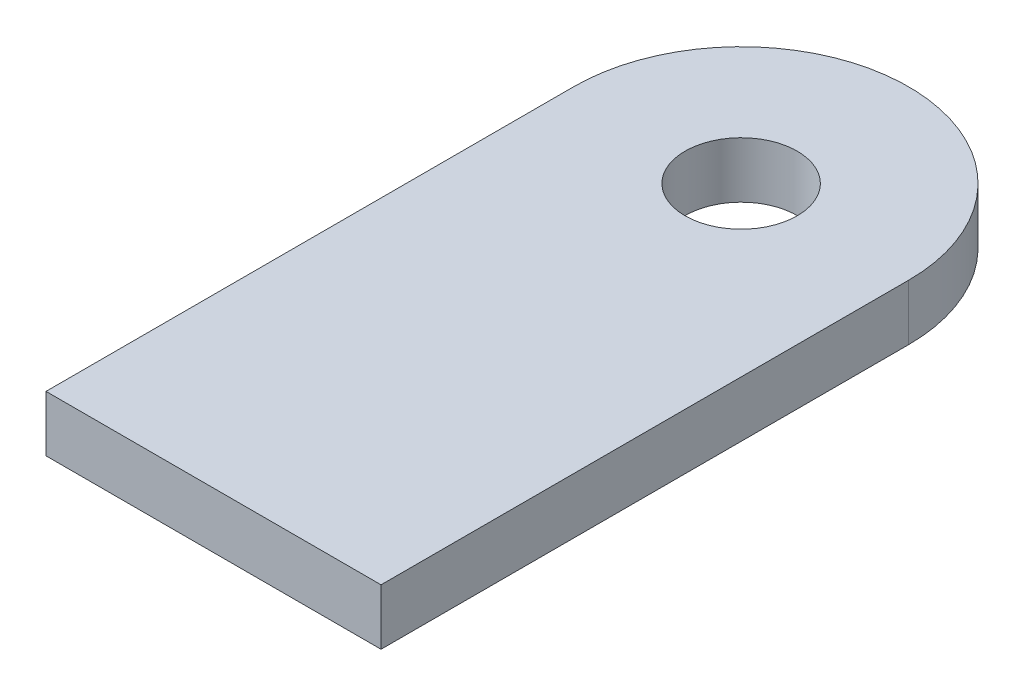
ISO-10303-21;
HEADER;
FILE_DESCRIPTION(('STEP AP214'),'2;1');
FILE_NAME('part.step','',(''),(''),'','','');
FILE_SCHEMA(('AUTOMOTIVE_DESIGN { 1 0 10303 214 1 1 1 1 }'));
ENDSEC;
DATA;
#1=APPLICATION_CONTEXT('core data for automotive mechanical design processes');
#2=APPLICATION_PROTOCOL_DEFINITION('international standard','automotive_design',2000,#1);
#3=PRODUCT_CONTEXT('',#1,'mechanical');
#4=PRODUCT('Part','Part','',(#3));
#5=PRODUCT_RELATED_PRODUCT_CATEGORY('part','',(#4));
#6=PRODUCT_DEFINITION_FORMATION('','',#4);
#7=PRODUCT_DEFINITION_CONTEXT('part definition',#1,'design');
#8=PRODUCT_DEFINITION('design','',#6,#7);
#9=PRODUCT_DEFINITION_SHAPE('','',#8);
#10=(LENGTH_UNIT() NAMED_UNIT(*) SI_UNIT(.MILLI.,.METRE.));
#11=(NAMED_UNIT(*) PLANE_ANGLE_UNIT() SI_UNIT($,.RADIAN.));
#12=(NAMED_UNIT(*) SI_UNIT($,.STERADIAN.) SOLID_ANGLE_UNIT());
#13=UNCERTAINTY_MEASURE_WITH_UNIT(LENGTH_MEASURE(1.E-05),#10,'distance_accuracy_value','');
#14=(GEOMETRIC_REPRESENTATION_CONTEXT(3) GLOBAL_UNCERTAINTY_ASSIGNED_CONTEXT((#13)) GLOBAL_UNIT_ASSIGNED_CONTEXT((#10,
#11,#12)) REPRESENTATION_CONTEXT('',''));
#15=CARTESIAN_POINT('',(0.,0.,0.));
#16=DIRECTION('',(0.,0.,1.));
#17=DIRECTION('',(1.,0.,0.));
#18=AXIS2_PLACEMENT_3D('',#15,#16,#17);
#19=CARTESIAN_POINT('',(12.7,4.23333333333333,-40.));
#20=DIRECTION('',(0.,-1.,0.));
#21=DIRECTION('',(0.,0.,-1.));
#22=AXIS2_PLACEMENT_3D('',#19,#20,#21);
#23=CYLINDRICAL_SURFACE('',#22,12.7);
#24=CARTESIAN_POINT('',(12.7,0.,-40.));
#25=DIRECTION('',(0.,1.,0.));
#26=DIRECTION('',(0.,0.,1.));
#27=AXIS2_PLACEMENT_3D('',#24,#25,#26);
#28=CIRCLE('',#27,12.7);
#29=CARTESIAN_POINT('',(0.,0.,-40.));
#30=VERTEX_POINT('',#29);
#31=CARTESIAN_POINT('',(25.4,0.,-40.));
#32=VERTEX_POINT('',#31);
#33=EDGE_CURVE('E123',#30,#32,#28,.F.);
#34=ORIENTED_EDGE('',*,*,#33,.F.);
#35=DIRECTION('',(0.,-1.,0.));
#36=VECTOR('',#35,1.);
#37=CARTESIAN_POINT('',(0.,4.23333333333333,-40.));
#38=LINE('',#37,#36);
#39=CARTESIAN_POINT('',(0.,4.23333333333333,-40.));
#40=VERTEX_POINT('',#39);
#41=EDGE_CURVE('E11',#40,#30,#38,.T.);
#42=ORIENTED_EDGE('',*,*,#41,.F.);
#43=CARTESIAN_POINT('',(12.7,4.23333333333333,-40.));
#44=DIRECTION('',(0.,1.,0.));
#45=DIRECTION('',(0.,0.,1.));
#46=AXIS2_PLACEMENT_3D('',#43,#44,#45);
#47=CIRCLE('',#46,12.7);
#48=CARTESIAN_POINT('',(25.4,4.23333333333333,-40.));
#49=VERTEX_POINT('',#48);
#50=EDGE_CURVE('E109',#40,#49,#47,.F.);
#51=ORIENTED_EDGE('',*,*,#50,.T.);
#52=DIRECTION('',(0.,-1.,0.));
#53=VECTOR('',#52,1.);
#54=CARTESIAN_POINT('',(25.4,4.23333333333333,-40.));
#55=LINE('',#54,#53);
#56=EDGE_CURVE('E86',#49,#32,#55,.T.);
#57=ORIENTED_EDGE('',*,*,#56,.T.);
#58=EDGE_LOOP('',(#34,#42,#51,#57));
#59=FACE_BOUND('',#58,.T.);
#60=ADVANCED_FACE('F45',(#59),#23,.T.);
#61=CARTESIAN_POINT('',(0.,4.23333333333333,0.));
#62=DIRECTION('',(-1.,0.,0.));
#63=DIRECTION('',(0.,0.,1.));
#64=AXIS2_PLACEMENT_3D('',#61,#62,#63);
#65=PLANE('',#64);
#66=DIRECTION('',(0.,0.,-1.));
#67=VECTOR('',#66,1.);
#68=CARTESIAN_POINT('',(0.,0.,0.));
#69=LINE('',#68,#67);
#70=CARTESIAN_POINT('',(0.,0.,0.));
#71=VERTEX_POINT('',#70);
#72=EDGE_CURVE('E98',#71,#30,#69,.T.);
#73=ORIENTED_EDGE('',*,*,#72,.F.);
#74=DIRECTION('',(0.,-1.,0.));
#75=VECTOR('',#74,1.);
#76=CARTESIAN_POINT('',(0.,4.23333333333333,0.));
#77=LINE('',#76,#75);
#78=CARTESIAN_POINT('',(0.,4.23333333333333,0.));
#79=VERTEX_POINT('',#78);
#80=EDGE_CURVE('E55',#79,#71,#77,.T.);
#81=ORIENTED_EDGE('',*,*,#80,.F.);
#82=DIRECTION('',(0.,0.,-1.));
#83=VECTOR('',#82,1.);
#84=CARTESIAN_POINT('',(0.,4.23333333333333,0.));
#85=LINE('',#84,#83);
#86=EDGE_CURVE('E96',#79,#40,#85,.T.);
#87=ORIENTED_EDGE('',*,*,#86,.T.);
#88=ORIENTED_EDGE('',*,*,#41,.T.);
#89=EDGE_LOOP('',(#73,#81,#87,#88));
#90=FACE_BOUND('',#89,.T.);
#91=ADVANCED_FACE('F94',(#90),#65,.T.);
#92=CARTESIAN_POINT('',(0.,4.23333333333333,0.));
#93=DIRECTION('',(0.,0.,-1.));
#94=DIRECTION('',(-1.,0.,0.));
#95=AXIS2_PLACEMENT_3D('',#92,#93,#94);
#96=PLANE('',#95);
#97=DIRECTION('',(1.,0.,0.));
#98=VECTOR('',#97,1.);
#99=CARTESIAN_POINT('',(0.,0.,0.));
#100=LINE('',#99,#98);
#101=CARTESIAN_POINT('',(25.4,0.,0.));
#102=VERTEX_POINT('',#101);
#103=EDGE_CURVE('E128',#71,#102,#100,.T.);
#104=ORIENTED_EDGE('',*,*,#103,.T.);
#105=DIRECTION('',(0.,-1.,0.));
#106=VECTOR('',#105,1.);
#107=CARTESIAN_POINT('',(25.4,4.23333333333333,0.));
#108=LINE('',#107,#106);
#109=CARTESIAN_POINT('',(25.4,4.23333333333333,0.));
#110=VERTEX_POINT('',#109);
#111=EDGE_CURVE('E102',#110,#102,#108,.T.);
#112=ORIENTED_EDGE('',*,*,#111,.F.);
#113=DIRECTION('',(1.,0.,0.));
#114=VECTOR('',#113,1.);
#115=CARTESIAN_POINT('',(0.,4.23333333333333,0.));
#116=LINE('',#115,#114);
#117=EDGE_CURVE('E104',#79,#110,#116,.T.);
#118=ORIENTED_EDGE('',*,*,#117,.F.);
#119=ORIENTED_EDGE('',*,*,#80,.T.);
#120=EDGE_LOOP('',(#104,#112,#118,#119));
#121=FACE_BOUND('',#120,.T.);
#122=ADVANCED_FACE('F105',(#121),#96,.F.);
#123=CARTESIAN_POINT('',(12.7,4.23333333333333,-40.));
#124=DIRECTION('',(0.,-1.,0.));
#125=DIRECTION('',(0.,0.,-1.));
#126=AXIS2_PLACEMENT_3D('',#123,#124,#125);
#127=CYLINDRICAL_SURFACE('',#126,4.24999999999999);
#128=CARTESIAN_POINT('',(12.7,4.23333333333333,-40.));
#129=DIRECTION('',(0.,1.,0.));
#130=DIRECTION('',(0.,0.,1.));
#131=AXIS2_PLACEMENT_3D('',#128,#129,#130);
#132=CIRCLE('',#131,4.24999999999999);
#133=CARTESIAN_POINT('',(12.7,4.23333333333333,-35.75));
#134=VERTEX_POINT('',#133);
#135=EDGE_CURVE('E113',#134,#134,#132,.T.);
#136=ORIENTED_EDGE('',*,*,#135,.T.);
#137=EDGE_LOOP('',(#136));
#138=FACE_BOUND('',#137,.T.);
#139=CARTESIAN_POINT('',(12.7,0.,-40.));
#140=DIRECTION('',(0.,1.,0.));
#141=DIRECTION('',(0.,0.,1.));
#142=AXIS2_PLACEMENT_3D('',#139,#140,#141);
#143=CIRCLE('',#142,4.24999999999999);
#144=CARTESIAN_POINT('',(12.7,0.,-35.75));
#145=VERTEX_POINT('',#144);
#146=EDGE_CURVE('E119',#145,#145,#143,.T.);
#147=ORIENTED_EDGE('',*,*,#146,.F.);
#148=EDGE_LOOP('',(#147));
#149=FACE_BOUND('',#148,.T.);
#150=ADVANCED_FACE('F47',(#138,#149),#127,.F.);
#151=CARTESIAN_POINT('',(25.4,4.23333333333333,0.));
#152=DIRECTION('',(-1.,0.,0.));
#153=DIRECTION('',(0.,0.,1.));
#154=AXIS2_PLACEMENT_3D('',#151,#152,#153);
#155=PLANE('',#154);
#156=DIRECTION('',(0.,0.,-1.));
#157=VECTOR('',#156,1.);
#158=CARTESIAN_POINT('',(25.4,0.,0.));
#159=LINE('',#158,#157);
#160=EDGE_CURVE('E79',#102,#32,#159,.T.);
#161=ORIENTED_EDGE('',*,*,#160,.T.);
#162=ORIENTED_EDGE('',*,*,#56,.F.);
#163=DIRECTION('',(0.,0.,-1.));
#164=VECTOR('',#163,1.);
#165=CARTESIAN_POINT('',(25.4,4.23333333333333,0.));
#166=LINE('',#165,#164);
#167=EDGE_CURVE('E63',#110,#49,#166,.T.);
#168=ORIENTED_EDGE('',*,*,#167,.F.);
#169=ORIENTED_EDGE('',*,*,#111,.T.);
#170=EDGE_LOOP('',(#161,#162,#168,#169));
#171=FACE_BOUND('',#170,.T.);
#172=ADVANCED_FACE('F137',(#171),#155,.F.);
#173=CARTESIAN_POINT('',(0.,4.23333333333333,0.));
#174=DIRECTION('',(0.,1.,0.));
#175=DIRECTION('',(0.,0.,1.));
#176=AXIS2_PLACEMENT_3D('',#173,#174,#175);
#177=PLANE('',#176);
#178=ORIENTED_EDGE('',*,*,#135,.F.);
#179=EDGE_LOOP('',(#178));
#180=FACE_BOUND('',#179,.T.);
#181=ORIENTED_EDGE('',*,*,#50,.F.);
#182=ORIENTED_EDGE('',*,*,#86,.F.);
#183=ORIENTED_EDGE('',*,*,#117,.T.);
#184=ORIENTED_EDGE('',*,*,#167,.T.);
#185=EDGE_LOOP('',(#181,#182,#183,#184));
#186=FACE_BOUND('',#185,.T.);
#187=ADVANCED_FACE('F108',(#180,#186),#177,.T.);
#188=CARTESIAN_POINT('',(0.,0.,0.));
#189=DIRECTION('',(0.,1.,0.));
#190=DIRECTION('',(0.,0.,1.));
#191=AXIS2_PLACEMENT_3D('',#188,#189,#190);
#192=PLANE('',#191);
#193=ORIENTED_EDGE('',*,*,#146,.T.);
#194=EDGE_LOOP('',(#193));
#195=FACE_BOUND('',#194,.T.);
#196=ORIENTED_EDGE('',*,*,#33,.T.);
#197=ORIENTED_EDGE('',*,*,#160,.F.);
#198=ORIENTED_EDGE('',*,*,#103,.F.);
#199=ORIENTED_EDGE('',*,*,#72,.T.);
#200=EDGE_LOOP('',(#196,#197,#198,#199));
#201=FACE_BOUND('',#200,.T.);
#202=ADVANCED_FACE('F138',(#195,#201),#192,.F.);
#203=CLOSED_SHELL('',(#60,#91,#122,#150,#172,#187,#202));
#204=MANIFOLD_SOLID_BREP('B2',#203);
#205=ADVANCED_BREP_SHAPE_REPRESENTATION('',(#18,#204),#14);
#206=SHAPE_DEFINITION_REPRESENTATION(#9,#205);
ENDSEC;
END-ISO-10303-21;
